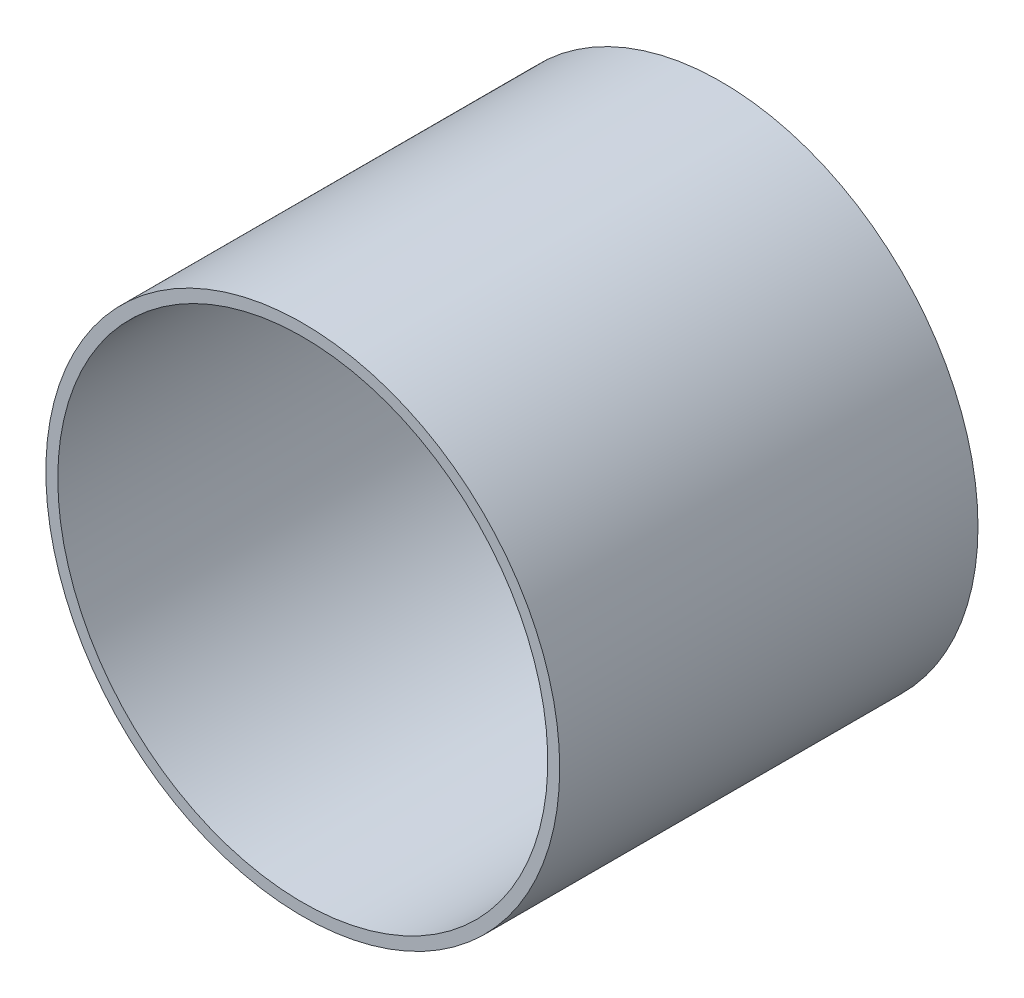
ISO-10303-21;
HEADER;
FILE_DESCRIPTION(('STEP AP214'),'2;1');
FILE_NAME('part.step','',(''),(''),'','','');
FILE_SCHEMA(('AUTOMOTIVE_DESIGN { 1 0 10303 214 1 1 1 1 }'));
ENDSEC;
DATA;
#1=APPLICATION_CONTEXT('core data for automotive mechanical design processes');
#2=APPLICATION_PROTOCOL_DEFINITION('international standard','automotive_design',2000,#1);
#3=PRODUCT_CONTEXT('',#1,'mechanical');
#4=PRODUCT('Part','Part','',(#3));
#5=PRODUCT_RELATED_PRODUCT_CATEGORY('part','',(#4));
#6=PRODUCT_DEFINITION_FORMATION('','',#4);
#7=PRODUCT_DEFINITION_CONTEXT('part definition',#1,'design');
#8=PRODUCT_DEFINITION('design','',#6,#7);
#9=PRODUCT_DEFINITION_SHAPE('','',#8);
#10=(LENGTH_UNIT() NAMED_UNIT(*) SI_UNIT(.MILLI.,.METRE.));
#11=(NAMED_UNIT(*) PLANE_ANGLE_UNIT() SI_UNIT($,.RADIAN.));
#12=(NAMED_UNIT(*) SI_UNIT($,.STERADIAN.) SOLID_ANGLE_UNIT());
#13=UNCERTAINTY_MEASURE_WITH_UNIT(LENGTH_MEASURE(1.E-05),#10,'distance_accuracy_value','');
#14=(GEOMETRIC_REPRESENTATION_CONTEXT(3) GLOBAL_UNCERTAINTY_ASSIGNED_CONTEXT((#13)) GLOBAL_UNIT_ASSIGNED_CONTEXT((#10,
#11,#12)) REPRESENTATION_CONTEXT('',''));
#15=CARTESIAN_POINT('',(0.,0.,0.));
#16=DIRECTION('',(0.,0.,1.));
#17=DIRECTION('',(1.,0.,0.));
#18=AXIS2_PLACEMENT_3D('',#15,#16,#17);
#19=CARTESIAN_POINT('',(0.,0.,350.));
#20=DIRECTION('',(0.,0.,-1.));
#21=DIRECTION('',(-1.,0.,0.));
#22=AXIS2_PLACEMENT_3D('',#19,#20,#21);
#23=CYLINDRICAL_SURFACE('',#22,215.);
#24=CARTESIAN_POINT('',(0.,0.,350.));
#25=DIRECTION('',(0.,0.,1.));
#26=DIRECTION('',(1.,0.,0.));
#27=AXIS2_PLACEMENT_3D('',#24,#25,#26);
#28=CIRCLE('',#27,215.);
#29=CARTESIAN_POINT('',(215.,0.,350.));
#30=VERTEX_POINT('',#29);
#31=EDGE_CURVE('E10',#30,#30,#28,.T.);
#32=ORIENTED_EDGE('',*,*,#31,.F.);
#33=EDGE_LOOP('',(#32));
#34=FACE_BOUND('',#33,.T.);
#35=CARTESIAN_POINT('',(0.,0.,0.));
#36=DIRECTION('',(0.,0.,1.));
#37=DIRECTION('',(1.,0.,0.));
#38=AXIS2_PLACEMENT_3D('',#35,#36,#37);
#39=CIRCLE('',#38,215.);
#40=CARTESIAN_POINT('',(215.,0.,0.));
#41=VERTEX_POINT('',#40);
#42=EDGE_CURVE('E44',#41,#41,#39,.T.);
#43=ORIENTED_EDGE('',*,*,#42,.T.);
#44=EDGE_LOOP('',(#43));
#45=FACE_BOUND('',#44,.T.);
#46=ADVANCED_FACE('F41',(#34,#45),#23,.T.);
#47=CARTESIAN_POINT('',(0.,0.,350.));
#48=DIRECTION('',(0.,0.,1.));
#49=DIRECTION('',(1.,0.,0.));
#50=AXIS2_PLACEMENT_3D('',#47,#48,#49);
#51=PLANE('',#50);
#52=CARTESIAN_POINT('',(0.,0.,350.));
#53=DIRECTION('',(0.,0.,-1.));
#54=DIRECTION('',(-1.,0.,0.));
#55=AXIS2_PLACEMENT_3D('',#52,#53,#54);
#56=CIRCLE('',#55,205.);
#57=CARTESIAN_POINT('',(-205.,0.,350.));
#58=VERTEX_POINT('',#57);
#59=EDGE_CURVE('E53',#58,#58,#56,.T.);
#60=ORIENTED_EDGE('',*,*,#59,.T.);
#61=EDGE_LOOP('',(#60));
#62=FACE_BOUND('',#61,.T.);
#63=ORIENTED_EDGE('',*,*,#31,.T.);
#64=EDGE_LOOP('',(#63));
#65=FACE_BOUND('',#64,.T.);
#66=ADVANCED_FACE('F63',(#62,#65),#51,.T.);
#67=CARTESIAN_POINT('',(0.,0.,0.));
#68=DIRECTION('',(0.,0.,1.));
#69=DIRECTION('',(1.,0.,0.));
#70=AXIS2_PLACEMENT_3D('',#67,#68,#69);
#71=PLANE('',#70);
#72=CARTESIAN_POINT('',(0.,0.,0.));
#73=DIRECTION('',(0.,0.,-1.));
#74=DIRECTION('',(-1.,0.,0.));
#75=AXIS2_PLACEMENT_3D('',#72,#73,#74);
#76=CIRCLE('',#75,205.);
#77=CARTESIAN_POINT('',(-205.,0.,0.));
#78=VERTEX_POINT('',#77);
#79=EDGE_CURVE('E55',#78,#78,#76,.T.);
#80=ORIENTED_EDGE('',*,*,#79,.F.);
#81=EDGE_LOOP('',(#80));
#82=FACE_BOUND('',#81,.T.);
#83=ORIENTED_EDGE('',*,*,#42,.F.);
#84=EDGE_LOOP('',(#83));
#85=FACE_BOUND('',#84,.T.);
#86=ADVANCED_FACE('F68',(#82,#85),#71,.F.);
#87=CARTESIAN_POINT('',(0.,0.,350.));
#88=DIRECTION('',(0.,0.,-1.));
#89=DIRECTION('',(-1.,0.,0.));
#90=AXIS2_PLACEMENT_3D('',#87,#88,#89);
#91=CYLINDRICAL_SURFACE('',#90,205.);
#92=ORIENTED_EDGE('',*,*,#59,.F.);
#93=EDGE_LOOP('',(#92));
#94=FACE_BOUND('',#93,.T.);
#95=ORIENTED_EDGE('',*,*,#79,.T.);
#96=EDGE_LOOP('',(#95));
#97=FACE_BOUND('',#96,.T.);
#98=ADVANCED_FACE('F65',(#94,#97),#91,.F.);
#99=CLOSED_SHELL('',(#46,#66,#86,#98));
#100=MANIFOLD_SOLID_BREP('B2',#99);
#101=ADVANCED_BREP_SHAPE_REPRESENTATION('',(#18,#100),#14);
#102=SHAPE_DEFINITION_REPRESENTATION(#9,#101);
ENDSEC;
END-ISO-10303-21;
